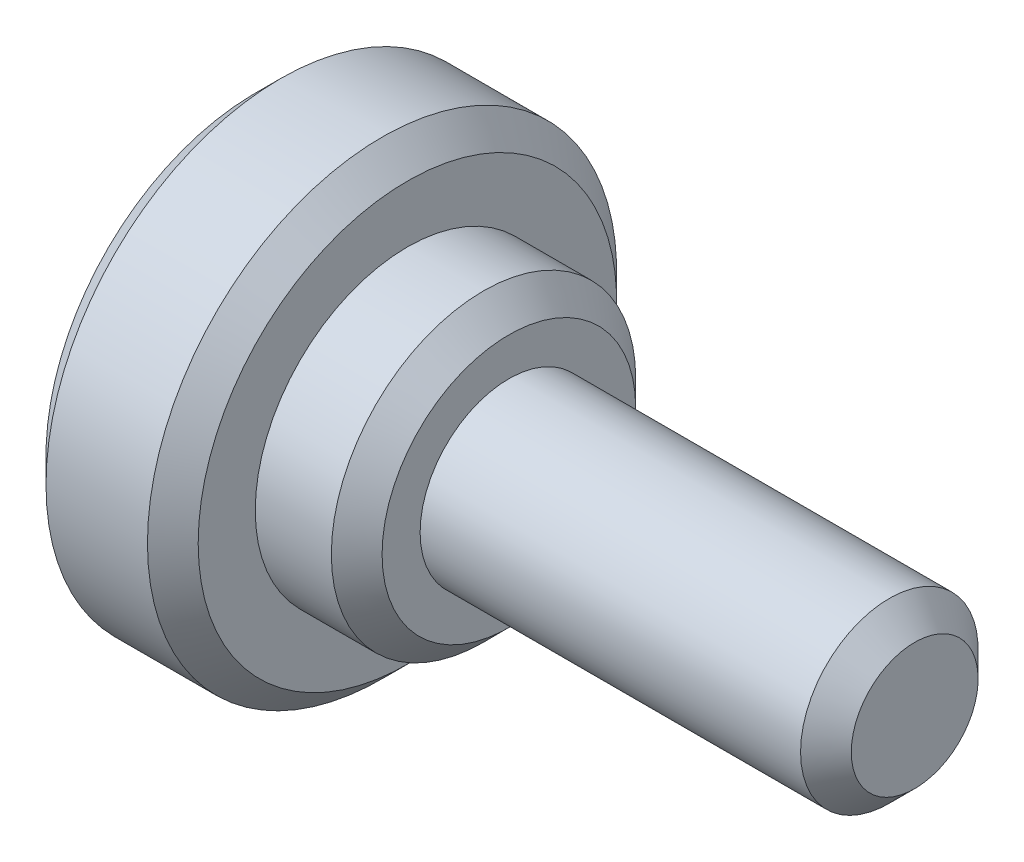
ISO-10303-21;
HEADER;
FILE_DESCRIPTION(('STEP AP214'),'2;1');
FILE_NAME('part.step','',(''),(''),'','','');
FILE_SCHEMA(('AUTOMOTIVE_DESIGN { 1 0 10303 214 1 1 1 1 }'));
ENDSEC;
DATA;
#1=APPLICATION_CONTEXT('core data for automotive mechanical design processes');
#2=APPLICATION_PROTOCOL_DEFINITION('international standard','automotive_design',2000,#1);
#3=PRODUCT_CONTEXT('',#1,'mechanical');
#4=PRODUCT('Part','Part','',(#3));
#5=PRODUCT_RELATED_PRODUCT_CATEGORY('part','',(#4));
#6=PRODUCT_DEFINITION_FORMATION('','',#4);
#7=PRODUCT_DEFINITION_CONTEXT('part definition',#1,'design');
#8=PRODUCT_DEFINITION('design','',#6,#7);
#9=PRODUCT_DEFINITION_SHAPE('','',#8);
#10=(LENGTH_UNIT() NAMED_UNIT(*) SI_UNIT(.MILLI.,.METRE.));
#11=(NAMED_UNIT(*) PLANE_ANGLE_UNIT() SI_UNIT($,.RADIAN.));
#12=(NAMED_UNIT(*) SI_UNIT($,.STERADIAN.) SOLID_ANGLE_UNIT());
#13=UNCERTAINTY_MEASURE_WITH_UNIT(LENGTH_MEASURE(1.E-05),#10,'distance_accuracy_value','');
#14=(GEOMETRIC_REPRESENTATION_CONTEXT(3) GLOBAL_UNCERTAINTY_ASSIGNED_CONTEXT((#13)) GLOBAL_UNIT_ASSIGNED_CONTEXT((#10,
#11,#12)) REPRESENTATION_CONTEXT('',''));
#15=CARTESIAN_POINT('',(0.,0.,0.));
#16=DIRECTION('',(0.,0.,1.));
#17=DIRECTION('',(1.,0.,0.));
#18=AXIS2_PLACEMENT_3D('',#15,#16,#17);
#19=CARTESIAN_POINT('',(4.,8.25,0.));
#20=DIRECTION('',(1.,0.,0.));
#21=DIRECTION('',(0.,0.,-1.));
#22=AXIS2_PLACEMENT_3D('',#19,#20,#21);
#23=PLANE('',#22);
#24=CARTESIAN_POINT('',(4.,0.,0.));
#25=DIRECTION('',(-1.,0.,0.));
#26=DIRECTION('',(0.,0.,1.));
#27=AXIS2_PLACEMENT_3D('',#24,#25,#26);
#28=CIRCLE('',#27,2.5);
#29=CARTESIAN_POINT('',(4.,0.,2.5));
#30=VERTEX_POINT('',#29);
#31=EDGE_CURVE('E67',#30,#30,#28,.T.);
#32=ORIENTED_EDGE('',*,*,#31,.F.);
#33=EDGE_LOOP('',(#32));
#34=FACE_BOUND('',#33,.T.);
#35=CARTESIAN_POINT('',(4.,0.,0.));
#36=DIRECTION('',(-1.,0.,0.));
#37=DIRECTION('',(0.,0.,1.));
#38=AXIS2_PLACEMENT_3D('',#35,#36,#37);
#39=CIRCLE('',#38,8.25);
#40=CARTESIAN_POINT('',(4.,0.,8.25));
#41=VERTEX_POINT('',#40);
#42=EDGE_CURVE('E124',#41,#41,#39,.T.);
#43=ORIENTED_EDGE('',*,*,#42,.T.);
#44=EDGE_LOOP('',(#43));
#45=FACE_BOUND('',#44,.T.);
#46=ADVANCED_FACE('F47',(#34,#45),#23,.F.);
#47=CARTESIAN_POINT('',(0.,0.,0.));
#48=DIRECTION('',(-1.,0.,0.));
#49=DIRECTION('',(0.,0.,1.));
#50=AXIS2_PLACEMENT_3D('',#47,#48,#49);
#51=CYLINDRICAL_SURFACE('',#50,2.5);
#52=CARTESIAN_POINT('',(6.,0.,0.));
#53=DIRECTION('',(-1.,0.,0.));
#54=DIRECTION('',(0.,0.,1.));
#55=AXIS2_PLACEMENT_3D('',#52,#53,#54);
#56=CIRCLE('',#55,2.5);
#57=CARTESIAN_POINT('',(6.,0.,2.5));
#58=VERTEX_POINT('',#57);
#59=EDGE_CURVE('E65',#58,#58,#56,.T.);
#60=ORIENTED_EDGE('',*,*,#59,.F.);
#61=EDGE_LOOP('',(#60));
#62=FACE_BOUND('',#61,.T.);
#63=ORIENTED_EDGE('',*,*,#31,.T.);
#64=EDGE_LOOP('',(#63));
#65=FACE_BOUND('',#64,.T.);
#66=ADVANCED_FACE('F61',(#62,#65),#51,.F.);
#67=CARTESIAN_POINT('',(6.,0.,0.));
#68=DIRECTION('',(-1.,0.,0.));
#69=DIRECTION('',(0.,0.,1.));
#70=AXIS2_PLACEMENT_3D('',#67,#68,#69);
#71=CONICAL_SURFACE('',#70,2.5,1.0471975511966);
#72=CARTESIAN_POINT('',(7.44337567297406,0.,0.));
#73=VERTEX_POINT('',#72);
#74=VERTEX_LOOP('',#73);
#75=FACE_BOUND('',#74,.T.);
#76=ORIENTED_EDGE('',*,*,#59,.T.);
#77=EDGE_LOOP('',(#76));
#78=FACE_BOUND('',#77,.T.);
#79=ADVANCED_FACE('F57',(#75,#78),#71,.F.);
#80=CARTESIAN_POINT('',(26.,3.5,0.));
#81=DIRECTION('',(-1.,0.,0.));
#82=DIRECTION('',(0.,0.,1.));
#83=AXIS2_PLACEMENT_3D('',#80,#81,#82);
#84=PLANE('',#83);
#85=CARTESIAN_POINT('',(26.,0.,0.));
#86=DIRECTION('',(-1.,0.,0.));
#87=DIRECTION('',(0.,0.,1.));
#88=AXIS2_PLACEMENT_3D('',#85,#86,#87);
#89=CIRCLE('',#88,2.5);
#90=CARTESIAN_POINT('',(26.,0.,2.5));
#91=VERTEX_POINT('',#90);
#92=EDGE_CURVE('E89',#91,#91,#89,.F.);
#93=ORIENTED_EDGE('',*,*,#92,.T.);
#94=EDGE_LOOP('',(#93));
#95=FACE_BOUND('',#94,.T.);
#96=ADVANCED_FACE('F60',(#95),#84,.F.);
#97=CARTESIAN_POINT('',(0.,0.,0.));
#98=DIRECTION('',(-1.,0.,0.));
#99=DIRECTION('',(0.,0.,1.));
#100=AXIS2_PLACEMENT_3D('',#97,#98,#99);
#101=CYLINDRICAL_SURFACE('',#100,3.5);
#102=CARTESIAN_POINT('',(25.,0.,0.));
#103=DIRECTION('',(-1.,0.,0.));
#104=DIRECTION('',(0.,0.,1.));
#105=AXIS2_PLACEMENT_3D('',#102,#103,#104);
#106=CIRCLE('',#105,3.5);
#107=CARTESIAN_POINT('',(25.,0.,3.5));
#108=VERTEX_POINT('',#107);
#109=EDGE_CURVE('E86',#108,#108,#106,.T.);
#110=ORIENTED_EDGE('',*,*,#109,.T.);
#111=EDGE_LOOP('',(#110));
#112=FACE_BOUND('',#111,.T.);
#113=CARTESIAN_POINT('',(10.,0.,0.));
#114=DIRECTION('',(-1.,0.,0.));
#115=DIRECTION('',(0.,0.,1.));
#116=AXIS2_PLACEMENT_3D('',#113,#114,#115);
#117=CIRCLE('',#116,3.5);
#118=CARTESIAN_POINT('',(10.,0.,3.5));
#119=VERTEX_POINT('',#118);
#120=EDGE_CURVE('E68',#119,#119,#117,.T.);
#121=ORIENTED_EDGE('',*,*,#120,.F.);
#122=EDGE_LOOP('',(#121));
#123=FACE_BOUND('',#122,.T.);
#124=ADVANCED_FACE('F178',(#112,#123),#101,.T.);
#125=CARTESIAN_POINT('',(10.,6.,0.));
#126=DIRECTION('',(-1.,0.,0.));
#127=DIRECTION('',(0.,0.,1.));
#128=AXIS2_PLACEMENT_3D('',#125,#126,#127);
#129=PLANE('',#128);
#130=CARTESIAN_POINT('',(10.,0.,0.));
#131=DIRECTION('',(-1.,0.,0.));
#132=DIRECTION('',(0.,0.,1.));
#133=AXIS2_PLACEMENT_3D('',#130,#131,#132);
#134=CIRCLE('',#133,5.);
#135=CARTESIAN_POINT('',(10.,0.,5.));
#136=VERTEX_POINT('',#135);
#137=EDGE_CURVE('E54',#136,#136,#134,.F.);
#138=ORIENTED_EDGE('',*,*,#137,.T.);
#139=EDGE_LOOP('',(#138));
#140=FACE_BOUND('',#139,.T.);
#141=ORIENTED_EDGE('',*,*,#120,.T.);
#142=EDGE_LOOP('',(#141));
#143=FACE_BOUND('',#142,.T.);
#144=ADVANCED_FACE('F97',(#140,#143),#129,.F.);
#145=CARTESIAN_POINT('',(0.,0.,0.));
#146=DIRECTION('',(-1.,0.,0.));
#147=DIRECTION('',(0.,0.,1.));
#148=AXIS2_PLACEMENT_3D('',#145,#146,#147);
#149=CYLINDRICAL_SURFACE('',#148,6.);
#150=CARTESIAN_POINT('',(9.,0.,0.));
#151=DIRECTION('',(-1.,0.,0.));
#152=DIRECTION('',(0.,0.,1.));
#153=AXIS2_PLACEMENT_3D('',#150,#151,#152);
#154=CIRCLE('',#153,6.);
#155=CARTESIAN_POINT('',(9.,0.,6.));
#156=VERTEX_POINT('',#155);
#157=EDGE_CURVE('E92',#156,#156,#154,.T.);
#158=ORIENTED_EDGE('',*,*,#157,.T.);
#159=EDGE_LOOP('',(#158));
#160=FACE_BOUND('',#159,.T.);
#161=CARTESIAN_POINT('',(6.,0.,0.));
#162=DIRECTION('',(-1.,0.,0.));
#163=DIRECTION('',(0.,0.,1.));
#164=AXIS2_PLACEMENT_3D('',#161,#162,#163);
#165=CIRCLE('',#164,6.);
#166=CARTESIAN_POINT('',(6.,0.,6.));
#167=VERTEX_POINT('',#166);
#168=EDGE_CURVE('E74',#167,#167,#165,.T.);
#169=ORIENTED_EDGE('',*,*,#168,.F.);
#170=EDGE_LOOP('',(#169));
#171=FACE_BOUND('',#170,.T.);
#172=ADVANCED_FACE('F106',(#160,#171),#149,.T.);
#173=CARTESIAN_POINT('',(6.,9.25,0.));
#174=DIRECTION('',(-1.,0.,0.));
#175=DIRECTION('',(0.,0.,1.));
#176=AXIS2_PLACEMENT_3D('',#173,#174,#175);
#177=PLANE('',#176);
#178=CARTESIAN_POINT('',(6.,0.,0.));
#179=DIRECTION('',(-1.,0.,0.));
#180=DIRECTION('',(0.,0.,1.));
#181=AXIS2_PLACEMENT_3D('',#178,#179,#180);
#182=CIRCLE('',#181,8.25000000000001);
#183=CARTESIAN_POINT('',(6.,0.,8.25000000000001));
#184=VERTEX_POINT('',#183);
#185=EDGE_CURVE('E13',#184,#184,#182,.F.);
#186=ORIENTED_EDGE('',*,*,#185,.T.);
#187=EDGE_LOOP('',(#186));
#188=FACE_BOUND('',#187,.T.);
#189=ORIENTED_EDGE('',*,*,#168,.T.);
#190=EDGE_LOOP('',(#189));
#191=FACE_BOUND('',#190,.T.);
#192=ADVANCED_FACE('F109',(#188,#191),#177,.F.);
#193=CARTESIAN_POINT('',(0.,0.,0.));
#194=DIRECTION('',(-1.,0.,0.));
#195=DIRECTION('',(0.,0.,1.));
#196=AXIS2_PLACEMENT_3D('',#193,#194,#195);
#197=CYLINDRICAL_SURFACE('',#196,9.25);
#198=CARTESIAN_POINT('',(1.00000000000001,0.,0.));
#199=DIRECTION('',(1.,0.,0.));
#200=DIRECTION('',(0.,0.,-1.));
#201=AXIS2_PLACEMENT_3D('',#198,#199,#200);
#202=CIRCLE('',#201,9.25);
#203=CARTESIAN_POINT('',(1.00000000000001,0.,-9.25));
#204=VERTEX_POINT('',#203);
#205=EDGE_CURVE('E83',#204,#204,#202,.T.);
#206=ORIENTED_EDGE('',*,*,#205,.T.);
#207=EDGE_LOOP('',(#206));
#208=FACE_BOUND('',#207,.T.);
#209=CARTESIAN_POINT('',(5.00000000000001,0.,0.));
#210=DIRECTION('',(-1.,0.,0.));
#211=DIRECTION('',(0.,0.,1.));
#212=AXIS2_PLACEMENT_3D('',#209,#210,#211);
#213=CIRCLE('',#212,9.25);
#214=CARTESIAN_POINT('',(5.00000000000001,0.,9.25));
#215=VERTEX_POINT('',#214);
#216=EDGE_CURVE('E80',#215,#215,#213,.T.);
#217=ORIENTED_EDGE('',*,*,#216,.T.);
#218=EDGE_LOOP('',(#217));
#219=FACE_BOUND('',#218,.T.);
#220=ADVANCED_FACE('F150',(#208,#219),#197,.T.);
#221=CARTESIAN_POINT('',(0.,9.25,0.));
#222=DIRECTION('',(1.,0.,0.));
#223=DIRECTION('',(0.,0.,-1.));
#224=AXIS2_PLACEMENT_3D('',#221,#222,#223);
#225=PLANE('',#224);
#226=CARTESIAN_POINT('',(0.,0.,0.));
#227=DIRECTION('',(1.,0.,0.));
#228=DIRECTION('',(0.,0.,-1.));
#229=AXIS2_PLACEMENT_3D('',#226,#227,#228);
#230=CIRCLE('',#229,8.25);
#231=CARTESIAN_POINT('',(0.,0.,-8.25));
#232=VERTEX_POINT('',#231);
#233=EDGE_CURVE('E71',#232,#232,#230,.F.);
#234=ORIENTED_EDGE('',*,*,#233,.T.);
#235=EDGE_LOOP('',(#234));
#236=FACE_BOUND('',#235,.T.);
#237=CARTESIAN_POINT('',(0.,0.,0.));
#238=DIRECTION('',(-1.,0.,0.));
#239=DIRECTION('',(0.,0.,1.));
#240=AXIS2_PLACEMENT_3D('',#237,#238,#239);
#241=CIRCLE('',#240,7.);
#242=CARTESIAN_POINT('',(0.,0.,7.));
#243=VERTEX_POINT('',#242);
#244=EDGE_CURVE('E114',#243,#243,#241,.T.);
#245=ORIENTED_EDGE('',*,*,#244,.F.);
#246=EDGE_LOOP('',(#245));
#247=FACE_BOUND('',#246,.T.);
#248=ADVANCED_FACE('F145',(#236,#247),#225,.F.);
#249=CARTESIAN_POINT('',(0.,0.,0.));
#250=DIRECTION('',(-1.,0.,0.));
#251=DIRECTION('',(0.,0.,1.));
#252=AXIS2_PLACEMENT_3D('',#249,#250,#251);
#253=CYLINDRICAL_SURFACE('',#252,7.);
#254=CARTESIAN_POINT('',(1.5,0.,0.));
#255=DIRECTION('',(-1.,0.,0.));
#256=DIRECTION('',(0.,0.,1.));
#257=AXIS2_PLACEMENT_3D('',#254,#255,#256);
#258=CIRCLE('',#257,7.);
#259=CARTESIAN_POINT('',(1.5,0.,7.));
#260=VERTEX_POINT('',#259);
#261=EDGE_CURVE('E116',#260,#260,#258,.T.);
#262=ORIENTED_EDGE('',*,*,#261,.F.);
#263=EDGE_LOOP('',(#262));
#264=FACE_BOUND('',#263,.T.);
#265=ORIENTED_EDGE('',*,*,#244,.T.);
#266=EDGE_LOOP('',(#265));
#267=FACE_BOUND('',#266,.T.);
#268=ADVANCED_FACE('F139',(#264,#267),#253,.F.);
#269=CARTESIAN_POINT('',(1.5,7.,0.));
#270=DIRECTION('',(-1.,0.,0.));
#271=DIRECTION('',(0.,0.,1.));
#272=AXIS2_PLACEMENT_3D('',#269,#270,#271);
#273=PLANE('',#272);
#274=CARTESIAN_POINT('',(1.5,0.,0.));
#275=DIRECTION('',(-1.,0.,0.));
#276=DIRECTION('',(0.,0.,1.));
#277=AXIS2_PLACEMENT_3D('',#274,#275,#276);
#278=CIRCLE('',#277,8.25);
#279=CARTESIAN_POINT('',(1.5,0.,8.25));
#280=VERTEX_POINT('',#279);
#281=EDGE_CURVE('E121',#280,#280,#278,.T.);
#282=ORIENTED_EDGE('',*,*,#281,.F.);
#283=EDGE_LOOP('',(#282));
#284=FACE_BOUND('',#283,.T.);
#285=ORIENTED_EDGE('',*,*,#261,.T.);
#286=EDGE_LOOP('',(#285));
#287=FACE_BOUND('',#286,.T.);
#288=ADVANCED_FACE('F133',(#284,#287),#273,.F.);
#289=CARTESIAN_POINT('',(0.,0.,0.));
#290=DIRECTION('',(-1.,0.,0.));
#291=DIRECTION('',(0.,0.,1.));
#292=AXIS2_PLACEMENT_3D('',#289,#290,#291);
#293=CYLINDRICAL_SURFACE('',#292,8.25);
#294=ORIENTED_EDGE('',*,*,#42,.F.);
#295=EDGE_LOOP('',(#294));
#296=FACE_BOUND('',#295,.T.);
#297=ORIENTED_EDGE('',*,*,#281,.T.);
#298=EDGE_LOOP('',(#297));
#299=FACE_BOUND('',#298,.T.);
#300=ADVANCED_FACE('F129',(#296,#299),#293,.F.);
#301=CARTESIAN_POINT('',(0.,0.,0.));
#302=DIRECTION('',(1.,0.,0.));
#303=DIRECTION('',(0.,0.,-1.));
#304=AXIS2_PLACEMENT_3D('',#301,#302,#303);
#305=CONICAL_SURFACE('',#304,8.25,0.785398163397448);
#306=ORIENTED_EDGE('',*,*,#205,.F.);
#307=EDGE_LOOP('',(#306));
#308=FACE_BOUND('',#307,.T.);
#309=ORIENTED_EDGE('',*,*,#233,.F.);
#310=EDGE_LOOP('',(#309));
#311=FACE_BOUND('',#310,.T.);
#312=ADVANCED_FACE('F132',(#308,#311),#305,.T.);
#313=CARTESIAN_POINT('',(25.,0.,0.));
#314=DIRECTION('',(-1.,0.,0.));
#315=DIRECTION('',(0.,0.,1.));
#316=AXIS2_PLACEMENT_3D('',#313,#314,#315);
#317=CONICAL_SURFACE('',#316,3.5,0.785398163397449);
#318=ORIENTED_EDGE('',*,*,#92,.F.);
#319=EDGE_LOOP('',(#318));
#320=FACE_BOUND('',#319,.T.);
#321=ORIENTED_EDGE('',*,*,#109,.F.);
#322=EDGE_LOOP('',(#321));
#323=FACE_BOUND('',#322,.T.);
#324=ADVANCED_FACE('F103',(#320,#323),#317,.T.);
#325=CARTESIAN_POINT('',(9.,0.,0.));
#326=DIRECTION('',(-1.,0.,0.));
#327=DIRECTION('',(0.,0.,1.));
#328=AXIS2_PLACEMENT_3D('',#325,#326,#327);
#329=CONICAL_SURFACE('',#328,6.,0.785398163397449);
#330=ORIENTED_EDGE('',*,*,#137,.F.);
#331=EDGE_LOOP('',(#330));
#332=FACE_BOUND('',#331,.T.);
#333=ORIENTED_EDGE('',*,*,#157,.F.);
#334=EDGE_LOOP('',(#333));
#335=FACE_BOUND('',#334,.T.);
#336=ADVANCED_FACE('F100',(#332,#335),#329,.T.);
#337=CARTESIAN_POINT('',(5.00000000000001,0.,0.));
#338=DIRECTION('',(-1.,0.,0.));
#339=DIRECTION('',(0.,0.,1.));
#340=AXIS2_PLACEMENT_3D('',#337,#338,#339);
#341=CONICAL_SURFACE('',#340,9.25,0.785398163397449);
#342=ORIENTED_EDGE('',*,*,#185,.F.);
#343=EDGE_LOOP('',(#342));
#344=FACE_BOUND('',#343,.T.);
#345=ORIENTED_EDGE('',*,*,#216,.F.);
#346=EDGE_LOOP('',(#345));
#347=FACE_BOUND('',#346,.T.);
#348=ADVANCED_FACE('F49',(#344,#347),#341,.T.);
#349=CLOSED_SHELL('',(#46,#66,#79,#96,#124,#144,#172,#192,#220,#248,#268,#288,#300,#312,#324,
#336,#348));
#350=MANIFOLD_SOLID_BREP('B2',#349);
#351=ADVANCED_BREP_SHAPE_REPRESENTATION('',(#18,#350),#14);
#352=SHAPE_DEFINITION_REPRESENTATION(#9,#351);
ENDSEC;
END-ISO-10303-21;
